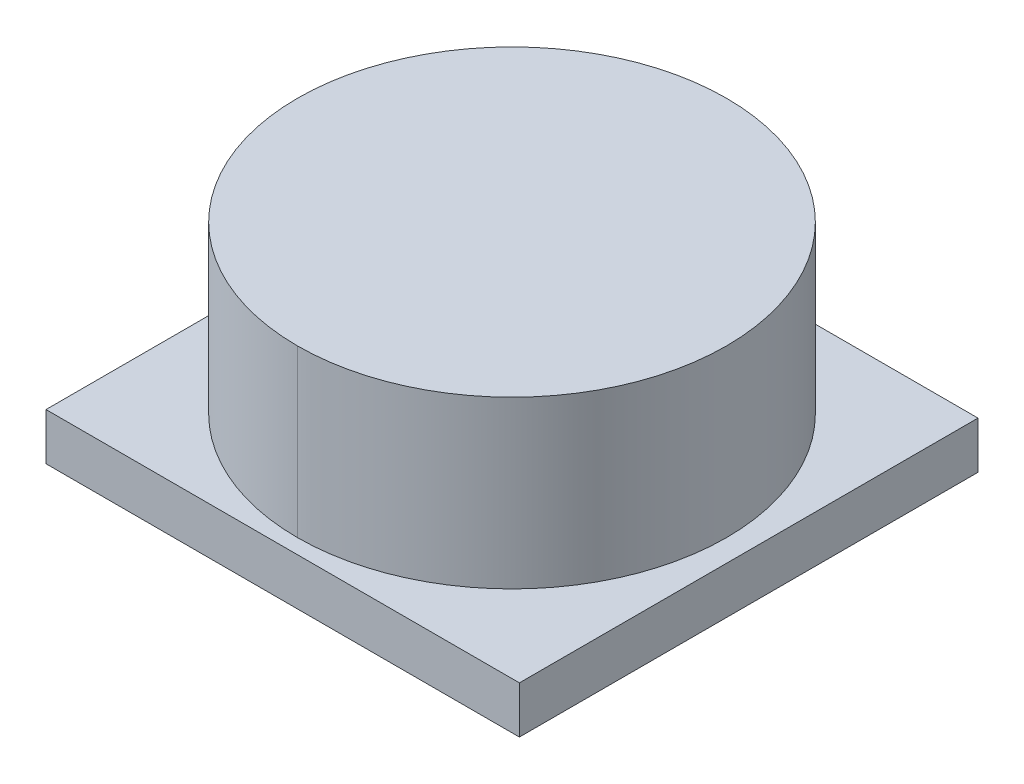
ISO-10303-21;
HEADER;
FILE_DESCRIPTION(('STEP AP214'),'2;1');
FILE_NAME('part.step','',(''),(''),'','','');
FILE_SCHEMA(('AUTOMOTIVE_DESIGN { 1 0 10303 214 1 1 1 1 }'));
ENDSEC;
DATA;
#1=APPLICATION_CONTEXT('core data for automotive mechanical design processes');
#2=APPLICATION_PROTOCOL_DEFINITION('international standard','automotive_design',2000,#1);
#3=PRODUCT_CONTEXT('',#1,'mechanical');
#4=PRODUCT('Part','Part','',(#3));
#5=PRODUCT_RELATED_PRODUCT_CATEGORY('part','',(#4));
#6=PRODUCT_DEFINITION_FORMATION('','',#4);
#7=PRODUCT_DEFINITION_CONTEXT('part definition',#1,'design');
#8=PRODUCT_DEFINITION('design','',#6,#7);
#9=PRODUCT_DEFINITION_SHAPE('','',#8);
#10=(LENGTH_UNIT() NAMED_UNIT(*) SI_UNIT(.MILLI.,.METRE.));
#11=(NAMED_UNIT(*) PLANE_ANGLE_UNIT() SI_UNIT($,.RADIAN.));
#12=(NAMED_UNIT(*) SI_UNIT($,.STERADIAN.) SOLID_ANGLE_UNIT());
#13=UNCERTAINTY_MEASURE_WITH_UNIT(LENGTH_MEASURE(1.E-05),#10,'distance_accuracy_value','');
#14=(GEOMETRIC_REPRESENTATION_CONTEXT(3) GLOBAL_UNCERTAINTY_ASSIGNED_CONTEXT((#13)) GLOBAL_UNIT_ASSIGNED_CONTEXT((#10,
#11,#12)) REPRESENTATION_CONTEXT('',''));
#15=CARTESIAN_POINT('',(0.,0.,0.));
#16=DIRECTION('',(0.,0.,1.));
#17=DIRECTION('',(1.,0.,0.));
#18=AXIS2_PLACEMENT_3D('',#15,#16,#17);
#19=CARTESIAN_POINT('',(3.2,2.88,-3.1));
#20=DIRECTION('',(0.,1.,0.));
#21=DIRECTION('',(1.,0.,0.));
#22=AXIS2_PLACEMENT_3D('',#19,#20,#21);
#23=PLANE('',#22);
#24=CARTESIAN_POINT('',(3.2,2.88,-3.1));
#25=DIRECTION('',(0.,1.,0.));
#26=DIRECTION('',(0.,0.,1.));
#27=AXIS2_PLACEMENT_3D('',#24,#25,#26);
#28=CIRCLE('',#27,2.9);
#29=CARTESIAN_POINT('',(3.2,2.88,-6.));
#30=VERTEX_POINT('',#29);
#31=CARTESIAN_POINT('',(3.2,2.88,-0.2));
#32=VERTEX_POINT('',#31);
#33=EDGE_CURVE('E11',#30,#32,#28,.T.);
#34=ORIENTED_EDGE('',*,*,#33,.T.);
#35=CARTESIAN_POINT('',(3.2,2.88,-3.1));
#36=DIRECTION('',(0.,1.,0.));
#37=DIRECTION('',(0.,0.,1.));
#38=AXIS2_PLACEMENT_3D('',#35,#36,#37);
#39=CIRCLE('',#38,2.9);
#40=EDGE_CURVE('E158',#32,#30,#39,.T.);
#41=ORIENTED_EDGE('',*,*,#40,.T.);
#42=EDGE_LOOP('',(#34,#41));
#43=FACE_BOUND('',#42,.T.);
#44=ADVANCED_FACE('F17',(#43),#23,.T.);
#45=CARTESIAN_POINT('',(3.2,2.88,-3.1));
#46=DIRECTION('',(0.,-1.,0.));
#47=DIRECTION('',(0.,0.,-1.));
#48=AXIS2_PLACEMENT_3D('',#45,#46,#47);
#49=CYLINDRICAL_SURFACE('',#48,2.9);
#50=DIRECTION('',(0.,-1.,0.));
#51=VECTOR('',#50,1.);
#52=CARTESIAN_POINT('',(3.2,2.88,-0.2));
#53=LINE('',#52,#51);
#54=CARTESIAN_POINT('',(3.2,0.635,-0.2));
#55=VERTEX_POINT('',#54);
#56=EDGE_CURVE('E153',#32,#55,#53,.T.);
#57=ORIENTED_EDGE('',*,*,#56,.F.);
#58=ORIENTED_EDGE('',*,*,#33,.F.);
#59=DIRECTION('',(0.,-1.,0.));
#60=VECTOR('',#59,1.);
#61=CARTESIAN_POINT('',(3.2,2.88,-6.));
#62=LINE('',#61,#60);
#63=CARTESIAN_POINT('',(3.2,0.635,-6.));
#64=VERTEX_POINT('',#63);
#65=EDGE_CURVE('E141',#30,#64,#62,.T.);
#66=ORIENTED_EDGE('',*,*,#65,.T.);
#67=CARTESIAN_POINT('',(3.2,0.635,-3.1));
#68=DIRECTION('',(0.,1.,0.));
#69=DIRECTION('',(0.,0.,1.));
#70=AXIS2_PLACEMENT_3D('',#67,#68,#69);
#71=CIRCLE('',#70,2.9);
#72=EDGE_CURVE('E21',#64,#55,#71,.T.);
#73=ORIENTED_EDGE('',*,*,#72,.T.);
#74=EDGE_LOOP('',(#57,#58,#66,#73));
#75=FACE_BOUND('',#74,.T.);
#76=ADVANCED_FACE('F179',(#75),#49,.T.);
#77=CARTESIAN_POINT('',(0.,0.,0.));
#78=DIRECTION('',(0.,-1.,0.));
#79=DIRECTION('',(0.,0.,-1.));
#80=AXIS2_PLACEMENT_3D('',#77,#78,#79);
#81=PLANE('',#80);
#82=DIRECTION('',(0.,0.,1.));
#83=VECTOR('',#82,1.);
#84=CARTESIAN_POINT('',(0.,0.,0.));
#85=LINE('',#84,#83);
#86=CARTESIAN_POINT('',(0.,0.,-6.2));
#87=VERTEX_POINT('',#86);
#88=CARTESIAN_POINT('',(0.,0.,0.));
#89=VERTEX_POINT('',#88);
#90=EDGE_CURVE('E114',#87,#89,#85,.T.);
#91=ORIENTED_EDGE('',*,*,#90,.F.);
#92=DIRECTION('',(-1.,0.,0.));
#93=VECTOR('',#92,1.);
#94=CARTESIAN_POINT('',(0.,0.,-6.2));
#95=LINE('',#94,#93);
#96=CARTESIAN_POINT('',(6.4,0.,-6.2));
#97=VERTEX_POINT('',#96);
#98=EDGE_CURVE('E49',#97,#87,#95,.T.);
#99=ORIENTED_EDGE('',*,*,#98,.F.);
#100=DIRECTION('',(0.,0.,-1.));
#101=VECTOR('',#100,1.);
#102=CARTESIAN_POINT('',(6.4,0.,0.));
#103=LINE('',#102,#101);
#104=CARTESIAN_POINT('',(6.4,0.,0.));
#105=VERTEX_POINT('',#104);
#106=EDGE_CURVE('E128',#105,#97,#103,.T.);
#107=ORIENTED_EDGE('',*,*,#106,.F.);
#108=DIRECTION('',(1.,0.,0.));
#109=VECTOR('',#108,1.);
#110=CARTESIAN_POINT('',(0.,0.,0.));
#111=LINE('',#110,#109);
#112=EDGE_CURVE('E104',#89,#105,#111,.T.);
#113=ORIENTED_EDGE('',*,*,#112,.F.);
#114=EDGE_LOOP('',(#91,#99,#107,#113));
#115=FACE_BOUND('',#114,.T.);
#116=ADVANCED_FACE('F19',(#115),#81,.T.);
#117=CARTESIAN_POINT('',(0.,0.635,0.));
#118=DIRECTION('',(0.,-1.,0.));
#119=DIRECTION('',(0.,0.,-1.));
#120=AXIS2_PLACEMENT_3D('',#117,#118,#119);
#121=PLANE('',#120);
#122=DIRECTION('',(0.,0.,1.));
#123=VECTOR('',#122,1.);
#124=CARTESIAN_POINT('',(0.,0.635,0.));
#125=LINE('',#124,#123);
#126=CARTESIAN_POINT('',(0.,0.635,-6.2));
#127=VERTEX_POINT('',#126);
#128=CARTESIAN_POINT('',(0.,0.635,0.));
#129=VERTEX_POINT('',#128);
#130=EDGE_CURVE('E92',#127,#129,#125,.T.);
#131=ORIENTED_EDGE('',*,*,#130,.T.);
#132=DIRECTION('',(1.,0.,0.));
#133=VECTOR('',#132,1.);
#134=CARTESIAN_POINT('',(0.,0.635,0.));
#135=LINE('',#134,#133);
#136=CARTESIAN_POINT('',(6.4,0.635,0.));
#137=VERTEX_POINT('',#136);
#138=EDGE_CURVE('E126',#129,#137,#135,.T.);
#139=ORIENTED_EDGE('',*,*,#138,.T.);
#140=DIRECTION('',(0.,0.,-1.));
#141=VECTOR('',#140,1.);
#142=CARTESIAN_POINT('',(6.4,0.635,0.));
#143=LINE('',#142,#141);
#144=CARTESIAN_POINT('',(6.4,0.635,-6.2));
#145=VERTEX_POINT('',#144);
#146=EDGE_CURVE('E94',#137,#145,#143,.T.);
#147=ORIENTED_EDGE('',*,*,#146,.T.);
#148=DIRECTION('',(-1.,0.,0.));
#149=VECTOR('',#148,1.);
#150=CARTESIAN_POINT('',(0.,0.635,-6.2));
#151=LINE('',#150,#149);
#152=EDGE_CURVE('E39',#145,#127,#151,.T.);
#153=ORIENTED_EDGE('',*,*,#152,.T.);
#154=EDGE_LOOP('',(#131,#139,#147,#153));
#155=FACE_BOUND('',#154,.T.);
#156=ORIENTED_EDGE('',*,*,#72,.F.);
#157=CARTESIAN_POINT('',(3.2,0.635,-3.1));
#158=DIRECTION('',(0.,1.,0.));
#159=DIRECTION('',(0.,0.,1.));
#160=AXIS2_PLACEMENT_3D('',#157,#158,#159);
#161=CIRCLE('',#160,2.9);
#162=EDGE_CURVE('E146',#55,#64,#161,.T.);
#163=ORIENTED_EDGE('',*,*,#162,.F.);
#164=EDGE_LOOP('',(#156,#163));
#165=FACE_BOUND('',#164,.T.);
#166=ADVANCED_FACE('F88',(#155,#165),#121,.F.);
#167=CARTESIAN_POINT('',(0.,0.635,-6.2));
#168=DIRECTION('',(0.,0.,1.));
#169=DIRECTION('',(1.,0.,0.));
#170=AXIS2_PLACEMENT_3D('',#167,#168,#169);
#171=PLANE('',#170);
#172=ORIENTED_EDGE('',*,*,#98,.T.);
#173=DIRECTION('',(0.,-1.,0.));
#174=VECTOR('',#173,1.);
#175=CARTESIAN_POINT('',(0.,0.635,-6.2));
#176=LINE('',#175,#174);
#177=EDGE_CURVE('E99',#127,#87,#176,.T.);
#178=ORIENTED_EDGE('',*,*,#177,.F.);
#179=ORIENTED_EDGE('',*,*,#152,.F.);
#180=DIRECTION('',(0.,-1.,0.));
#181=VECTOR('',#180,1.);
#182=CARTESIAN_POINT('',(6.4,0.635,-6.2));
#183=LINE('',#182,#181);
#184=EDGE_CURVE('E125',#145,#97,#183,.T.);
#185=ORIENTED_EDGE('',*,*,#184,.T.);
#186=EDGE_LOOP('',(#172,#178,#179,#185));
#187=FACE_BOUND('',#186,.T.);
#188=ADVANCED_FACE('F100',(#187),#171,.F.);
#189=CARTESIAN_POINT('',(6.4,0.635,0.));
#190=DIRECTION('',(-1.,0.,0.));
#191=DIRECTION('',(0.,0.,1.));
#192=AXIS2_PLACEMENT_3D('',#189,#190,#191);
#193=PLANE('',#192);
#194=ORIENTED_EDGE('',*,*,#106,.T.);
#195=ORIENTED_EDGE('',*,*,#184,.F.);
#196=ORIENTED_EDGE('',*,*,#146,.F.);
#197=DIRECTION('',(0.,-1.,0.));
#198=VECTOR('',#197,1.);
#199=CARTESIAN_POINT('',(6.4,0.635,0.));
#200=LINE('',#199,#198);
#201=EDGE_CURVE('E122',#137,#105,#200,.T.);
#202=ORIENTED_EDGE('',*,*,#201,.T.);
#203=EDGE_LOOP('',(#194,#195,#196,#202));
#204=FACE_BOUND('',#203,.T.);
#205=ADVANCED_FACE('F137',(#204),#193,.F.);
#206=CARTESIAN_POINT('',(0.,0.635,0.));
#207=DIRECTION('',(0.,0.,-1.));
#208=DIRECTION('',(0.,-1.,0.));
#209=AXIS2_PLACEMENT_3D('',#206,#207,#208);
#210=PLANE('',#209);
#211=ORIENTED_EDGE('',*,*,#112,.T.);
#212=ORIENTED_EDGE('',*,*,#201,.F.);
#213=ORIENTED_EDGE('',*,*,#138,.F.);
#214=DIRECTION('',(0.,-1.,0.));
#215=VECTOR('',#214,1.);
#216=CARTESIAN_POINT('',(0.,0.635,0.));
#217=LINE('',#216,#215);
#218=EDGE_CURVE('E108',#129,#89,#217,.T.);
#219=ORIENTED_EDGE('',*,*,#218,.T.);
#220=EDGE_LOOP('',(#211,#212,#213,#219));
#221=FACE_BOUND('',#220,.T.);
#222=ADVANCED_FACE('F140',(#221),#210,.F.);
#223=CARTESIAN_POINT('',(0.,0.635,0.));
#224=DIRECTION('',(1.,0.,0.));
#225=DIRECTION('',(0.,1.,0.));
#226=AXIS2_PLACEMENT_3D('',#223,#224,#225);
#227=PLANE('',#226);
#228=ORIENTED_EDGE('',*,*,#90,.T.);
#229=ORIENTED_EDGE('',*,*,#218,.F.);
#230=ORIENTED_EDGE('',*,*,#130,.F.);
#231=ORIENTED_EDGE('',*,*,#177,.T.);
#232=EDGE_LOOP('',(#228,#229,#230,#231));
#233=FACE_BOUND('',#232,.T.);
#234=ADVANCED_FACE('F106',(#233),#227,.F.);
#235=CARTESIAN_POINT('',(3.2,2.88,-3.1));
#236=DIRECTION('',(0.,-1.,0.));
#237=DIRECTION('',(0.,0.,-1.));
#238=AXIS2_PLACEMENT_3D('',#235,#236,#237);
#239=CYLINDRICAL_SURFACE('',#238,2.9);
#240=ORIENTED_EDGE('',*,*,#40,.F.);
#241=ORIENTED_EDGE('',*,*,#56,.T.);
#242=ORIENTED_EDGE('',*,*,#162,.T.);
#243=ORIENTED_EDGE('',*,*,#65,.F.);
#244=EDGE_LOOP('',(#240,#241,#242,#243));
#245=FACE_BOUND('',#244,.T.);
#246=ADVANCED_FACE('F175',(#245),#239,.T.);
#247=CLOSED_SHELL('',(#44,#76,#116,#166,#188,#205,#222,#234,#246));
#248=MANIFOLD_SOLID_BREP('B1',#247);
#249=ADVANCED_BREP_SHAPE_REPRESENTATION('',(#18,#248),#14);
#250=SHAPE_DEFINITION_REPRESENTATION(#9,#249);
ENDSEC;
END-ISO-10303-21;
